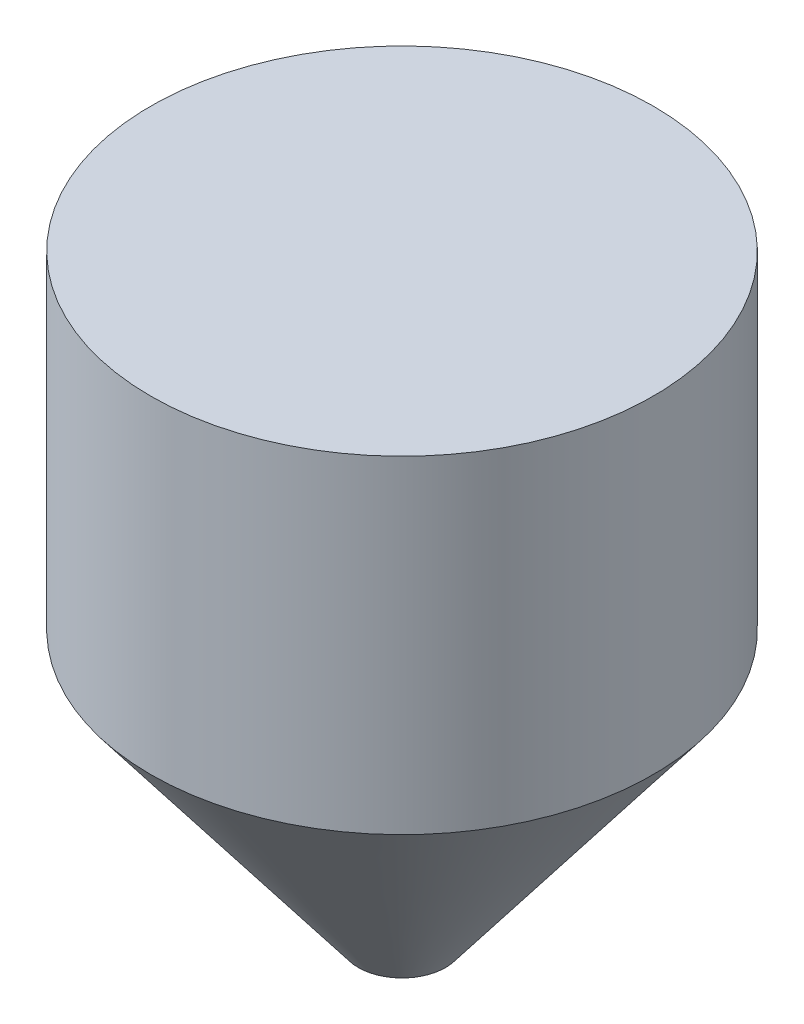
ISO-10303-21;
HEADER;
FILE_DESCRIPTION(('STEP AP214'),'2;1');
FILE_NAME('part.step','',(''),(''),'','','');
FILE_SCHEMA(('AUTOMOTIVE_DESIGN { 1 0 10303 214 1 1 1 1 }'));
ENDSEC;
DATA;
#1=APPLICATION_CONTEXT('core data for automotive mechanical design processes');
#2=APPLICATION_PROTOCOL_DEFINITION('international standard','automotive_design',2000,#1);
#3=PRODUCT_CONTEXT('',#1,'mechanical');
#4=PRODUCT('Part','Part','',(#3));
#5=PRODUCT_RELATED_PRODUCT_CATEGORY('part','',(#4));
#6=PRODUCT_DEFINITION_FORMATION('','',#4);
#7=PRODUCT_DEFINITION_CONTEXT('part definition',#1,'design');
#8=PRODUCT_DEFINITION('design','',#6,#7);
#9=PRODUCT_DEFINITION_SHAPE('','',#8);
#10=(LENGTH_UNIT() NAMED_UNIT(*) SI_UNIT(.MILLI.,.METRE.));
#11=(NAMED_UNIT(*) PLANE_ANGLE_UNIT() SI_UNIT($,.RADIAN.));
#12=(NAMED_UNIT(*) SI_UNIT($,.STERADIAN.) SOLID_ANGLE_UNIT());
#13=UNCERTAINTY_MEASURE_WITH_UNIT(LENGTH_MEASURE(1.E-05),#10,'distance_accuracy_value','');
#14=(GEOMETRIC_REPRESENTATION_CONTEXT(3) GLOBAL_UNCERTAINTY_ASSIGNED_CONTEXT((#13)) GLOBAL_UNIT_ASSIGNED_CONTEXT((#10,
#11,#12)) REPRESENTATION_CONTEXT('',''));
#15=CARTESIAN_POINT('',(0.,0.,0.));
#16=DIRECTION('',(0.,0.,1.));
#17=DIRECTION('',(1.,0.,0.));
#18=AXIS2_PLACEMENT_3D('',#15,#16,#17);
#19=CARTESIAN_POINT('',(0.,-150.,0.));
#20=DIRECTION('',(0.,1.,0.));
#21=DIRECTION('',(0.,0.,1.));
#22=AXIS2_PLACEMENT_3D('',#19,#20,#21);
#23=CYLINDRICAL_SURFACE('',#22,115.);
#24=CARTESIAN_POINT('',(0.,-150.,0.));
#25=DIRECTION('',(0.,-1.,0.));
#26=DIRECTION('',(0.,0.,-1.));
#27=AXIS2_PLACEMENT_3D('',#24,#25,#26);
#28=CIRCLE('',#27,115.);
#29=CARTESIAN_POINT('',(0.,-150.,115.));
#30=VERTEX_POINT('',#29);
#31=EDGE_CURVE('E40',#30,#30,#28,.T.);
#32=ORIENTED_EDGE('',*,*,#31,.F.);
#33=EDGE_LOOP('',(#32));
#34=FACE_BOUND('',#33,.T.);
#35=CARTESIAN_POINT('',(0.,0.,0.));
#36=DIRECTION('',(0.,1.,0.));
#37=DIRECTION('',(0.,0.,1.));
#38=AXIS2_PLACEMENT_3D('',#35,#36,#37);
#39=CIRCLE('',#38,115.);
#40=CARTESIAN_POINT('',(0.,0.,115.));
#41=VERTEX_POINT('',#40);
#42=EDGE_CURVE('E11',#41,#41,#39,.T.);
#43=ORIENTED_EDGE('',*,*,#42,.F.);
#44=EDGE_LOOP('',(#43));
#45=FACE_BOUND('',#44,.T.);
#46=ADVANCED_FACE('F34',(#34,#45),#23,.T.);
#47=CARTESIAN_POINT('',(0.,0.,0.));
#48=DIRECTION('',(0.,1.,0.));
#49=DIRECTION('',(0.,0.,1.));
#50=AXIS2_PLACEMENT_3D('',#47,#48,#49);
#51=PLANE('',#50);
#52=ORIENTED_EDGE('',*,*,#42,.T.);
#53=EDGE_LOOP('',(#52));
#54=FACE_BOUND('',#53,.T.);
#55=ADVANCED_FACE('F68',(#54),#51,.T.);
#56=CARTESIAN_POINT('',(0.,-274.,0.));
#57=DIRECTION('',(0.,1.,0.));
#58=DIRECTION('',(0.,0.,1.));
#59=AXIS2_PLACEMENT_3D('',#56,#57,#58);
#60=PLANE('',#59);
#61=CARTESIAN_POINT('',(0.,-274.,0.));
#62=DIRECTION('',(0.,1.,0.));
#63=DIRECTION('',(0.,0.,1.));
#64=AXIS2_PLACEMENT_3D('',#61,#62,#63);
#65=CIRCLE('',#64,20.);
#66=CARTESIAN_POINT('',(0.,-274.,20.));
#67=VERTEX_POINT('',#66);
#68=EDGE_CURVE('E44',#67,#67,#65,.T.);
#69=ORIENTED_EDGE('',*,*,#68,.F.);
#70=EDGE_LOOP('',(#69));
#71=FACE_BOUND('',#70,.T.);
#72=ADVANCED_FACE('F58',(#71),#60,.F.);
#73=CARTESIAN_POINT('',(0.,-274.,0.));
#74=DIRECTION('',(0.,1.,0.));
#75=DIRECTION('',(0.,0.,1.));
#76=AXIS2_PLACEMENT_3D('',#73,#74,#75);
#77=CONICAL_SURFACE('',#76,20.,0.65374402840699);
#78=CARTESIAN_POINT('',(0.,-274.,20.));
#79=CARTESIAN_POINT('',(0.,-272.708333333333,20.9895833333333));
#80=CARTESIAN_POINT('',(0.,-271.416666666667,21.9791666666667));
#81=CARTESIAN_POINT('',(0.,-268.833333333333,23.9583333333333));
#82=CARTESIAN_POINT('',(0.,-267.541666666667,24.9479166666667));
#83=CARTESIAN_POINT('',(0.,-264.958333333333,26.9270833333333));
#84=CARTESIAN_POINT('',(0.,-263.666666666667,27.9166666666666));
#85=CARTESIAN_POINT('',(0.,-261.083333333333,29.8958333333333));
#86=CARTESIAN_POINT('',(0.,-259.791666666667,30.8854166666667));
#87=CARTESIAN_POINT('',(0.,-257.208333333333,32.8645833333333));
#88=CARTESIAN_POINT('',(0.,-255.916666666667,33.8541666666666));
#89=CARTESIAN_POINT('',(0.,-253.333333333333,35.8333333333333));
#90=CARTESIAN_POINT('',(0.,-252.041666666667,36.8229166666667));
#91=CARTESIAN_POINT('',(0.,-249.458333333333,38.8020833333333));
#92=CARTESIAN_POINT('',(0.,-248.166666666667,39.7916666666666));
#93=CARTESIAN_POINT('',(0.,-245.583333333333,41.7708333333333));
#94=CARTESIAN_POINT('',(0.,-244.291666666667,42.7604166666667));
#95=CARTESIAN_POINT('',(0.,-241.708333333333,44.7395833333333));
#96=CARTESIAN_POINT('',(0.,-240.416666666667,45.7291666666667));
#97=CARTESIAN_POINT('',(0.,-237.833333333333,47.7083333333333));
#98=CARTESIAN_POINT('',(0.,-236.541666666667,48.6979166666666));
#99=CARTESIAN_POINT('',(0.,-233.958333333333,50.6770833333333));
#100=CARTESIAN_POINT('',(0.,-232.666666666667,51.6666666666667));
#101=CARTESIAN_POINT('',(0.,-230.083333333333,53.6458333333333));
#102=CARTESIAN_POINT('',(0.,-228.791666666667,54.6354166666667));
#103=CARTESIAN_POINT('',(0.,-226.208333333333,56.6145833333333));
#104=CARTESIAN_POINT('',(0.,-224.916666666667,57.6041666666667));
#105=CARTESIAN_POINT('',(0.,-222.333333333333,59.5833333333333));
#106=CARTESIAN_POINT('',(0.,-221.041666666667,60.5729166666666));
#107=CARTESIAN_POINT('',(0.,-218.458333333333,62.5520833333333));
#108=CARTESIAN_POINT('',(0.,-217.166666666667,63.5416666666667));
#109=CARTESIAN_POINT('',(0.,-214.583333333333,65.5208333333333));
#110=CARTESIAN_POINT('',(0.,-213.291666666667,66.5104166666667));
#111=CARTESIAN_POINT('',(0.,-210.708333333333,68.4895833333333));
#112=CARTESIAN_POINT('',(0.,-209.416666666667,69.4791666666666));
#113=CARTESIAN_POINT('',(0.,-206.833333333333,71.4583333333333));
#114=CARTESIAN_POINT('',(0.,-205.541666666667,72.4479166666667));
#115=CARTESIAN_POINT('',(0.,-202.958333333333,74.4270833333333));
#116=CARTESIAN_POINT('',(0.,-201.666666666667,75.4166666666667));
#117=CARTESIAN_POINT('',(0.,-199.083333333333,77.3958333333333));
#118=CARTESIAN_POINT('',(0.,-197.791666666667,78.3854166666667));
#119=CARTESIAN_POINT('',(0.,-195.208333333333,80.3645833333333));
#120=CARTESIAN_POINT('',(0.,-193.916666666667,81.3541666666666));
#121=CARTESIAN_POINT('',(0.,-191.333333333333,83.3333333333333));
#122=CARTESIAN_POINT('',(0.,-190.041666666667,84.3229166666667));
#123=CARTESIAN_POINT('',(0.,-187.458333333333,86.3020833333333));
#124=CARTESIAN_POINT('',(0.,-186.166666666667,87.2916666666667));
#125=CARTESIAN_POINT('',(0.,-183.583333333333,89.2708333333333));
#126=CARTESIAN_POINT('',(0.,-182.291666666667,90.2604166666667));
#127=CARTESIAN_POINT('',(0.,-179.708333333333,92.2395833333333));
#128=CARTESIAN_POINT('',(0.,-178.416666666667,93.2291666666667));
#129=CARTESIAN_POINT('',(0.,-175.833333333333,95.2083333333333));
#130=CARTESIAN_POINT('',(0.,-174.541666666667,96.1979166666667));
#131=CARTESIAN_POINT('',(0.,-171.958333333333,98.1770833333333));
#132=CARTESIAN_POINT('',(0.,-170.666666666667,99.1666666666667));
#133=CARTESIAN_POINT('',(0.,-168.083333333333,101.145833333333));
#134=CARTESIAN_POINT('',(0.,-166.791666666667,102.135416666667));
#135=CARTESIAN_POINT('',(0.,-164.208333333333,104.114583333333));
#136=CARTESIAN_POINT('',(0.,-162.916666666667,105.104166666667));
#137=CARTESIAN_POINT('',(0.,-160.333333333333,107.083333333333));
#138=CARTESIAN_POINT('',(0.,-159.041666666667,108.072916666667));
#139=CARTESIAN_POINT('',(0.,-156.458333333333,110.052083333333));
#140=CARTESIAN_POINT('',(0.,-155.166666666667,111.041666666667));
#141=CARTESIAN_POINT('',(0.,-152.583333333333,113.020833333333));
#142=CARTESIAN_POINT('',(0.,-151.291666666667,114.010416666667));
#143=CARTESIAN_POINT('',(0.,-150.,115.));
#144=B_SPLINE_CURVE_WITH_KNOTS('',3,(#78,#79,#80,#81,#82,#83,#84,#85,#86,#87,#88,#89,#90,#91,
#92,#93,#94,#95,#96,#97,#98,#99,#100,#101,#102,#103,#104,#105,#106,#107,#108,#109,#110,#111,
#112,#113,#114,#115,#116,#117,#118,#119,#120,#121,#122,#123,#124,#125,#126,#127,#128,#129,#130,
#131,#132,#133,#134,#135,#136,#137,#138,#139,#140,#141,#142,#143),.UNSPECIFIED.,.F.,.F.,(4,2,2,
2,2,2,2,2,2,2,2,2,2,2,2,2,2,2,2,2,2,2,2,2,2,2,2,2,2,2,2,2,4),(0.,4.88150607522921,
9.76301215045847,14.6445182256877,19.5260243009169,24.4075303761462,29.2890364513754,
34.1705425266047,39.0520486018339,43.9335546770632,48.8150607522924,53.6965668275217,
58.5780729027509,63.4595789779801,68.3410850532094,73.2225911284386,78.1040972036679,
82.9856032788971,87.8671093541264,92.7486154293556,97.6301215045848,102.511627579814,
107.393133655043,112.274639730273,117.156145805502,122.037651880731,126.91915795596,
131.80066403119,136.682170106419,141.563676181648,146.445182256877,151.326688332106,
156.208194407336),.UNSPECIFIED.);
#145=EDGE_CURVE('BSEAM67',#67,#30,#144,.T.);
#146=ORIENTED_EDGE('',*,*,#68,.T.);
#147=ORIENTED_EDGE('',*,*,#31,.T.);
#148=ORIENTED_EDGE('',*,*,#145,.T.);
#149=ORIENTED_EDGE('',*,*,#145,.F.);
#150=EDGE_LOOP('',(#146,#148,#147,#149));
#151=FACE_BOUND('',#150,.T.);
#152=ADVANCED_FACE('F67',(#151),#77,.T.);
#153=CLOSED_SHELL('',(#46,#55,#72,#152));
#154=MANIFOLD_SOLID_BREP('B2',#153);
#155=ADVANCED_BREP_SHAPE_REPRESENTATION('',(#18,#154),#14);
#156=SHAPE_DEFINITION_REPRESENTATION(#9,#155);
ENDSEC;
END-ISO-10303-21;
